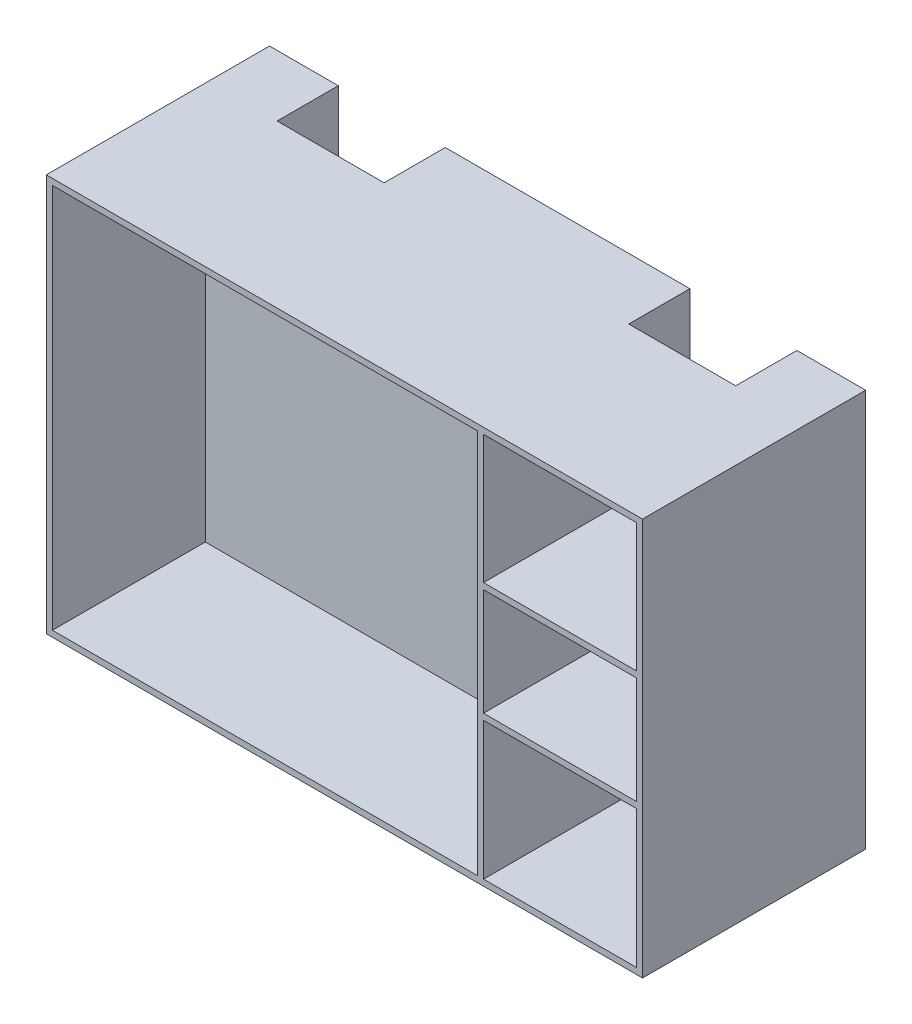
ISO-10303-21;
HEADER;
FILE_DESCRIPTION(('STEP AP214'),'2;1');
FILE_NAME('part.step','',(''),(''),'','','');
FILE_SCHEMA(('AUTOMOTIVE_DESIGN { 1 0 10303 214 1 1 1 1 }'));
ENDSEC;
DATA;
#1=APPLICATION_CONTEXT('core data for automotive mechanical design processes');
#2=APPLICATION_PROTOCOL_DEFINITION('international standard','automotive_design',2000,#1);
#3=PRODUCT_CONTEXT('',#1,'mechanical');
#4=PRODUCT('Part','Part','',(#3));
#5=PRODUCT_RELATED_PRODUCT_CATEGORY('part','',(#4));
#6=PRODUCT_DEFINITION_FORMATION('','',#4);
#7=PRODUCT_DEFINITION_CONTEXT('part definition',#1,'design');
#8=PRODUCT_DEFINITION('design','',#6,#7);
#9=PRODUCT_DEFINITION_SHAPE('','',#8);
#10=(LENGTH_UNIT() NAMED_UNIT(*) SI_UNIT(.MILLI.,.METRE.));
#11=(NAMED_UNIT(*) PLANE_ANGLE_UNIT() SI_UNIT($,.RADIAN.));
#12=(NAMED_UNIT(*) SI_UNIT($,.STERADIAN.) SOLID_ANGLE_UNIT());
#13=UNCERTAINTY_MEASURE_WITH_UNIT(LENGTH_MEASURE(1.E-05),#10,'distance_accuracy_value','');
#14=(GEOMETRIC_REPRESENTATION_CONTEXT(3) GLOBAL_UNCERTAINTY_ASSIGNED_CONTEXT((#13)) GLOBAL_UNIT_ASSIGNED_CONTEXT((#10,
#11,#12)) REPRESENTATION_CONTEXT('',''));
#15=CARTESIAN_POINT('',(0.,0.,0.));
#16=DIRECTION('',(0.,0.,1.));
#17=DIRECTION('',(1.,0.,0.));
#18=AXIS2_PLACEMENT_3D('',#15,#16,#17);
#19=CARTESIAN_POINT('',(0.,0.,-23.));
#20=DIRECTION('',(0.,0.,-1.));
#21=DIRECTION('',(-1.,0.,0.));
#22=AXIS2_PLACEMENT_3D('',#19,#20,#21);
#23=PLANE('',#22);
#24=DIRECTION('',(0.,-1.,0.));
#25=VECTOR('',#24,1.);
#26=CARTESIAN_POINT('',(103.307004172774,61.4710040641087,-23.));
#27=LINE('',#26,#25);
#28=CARTESIAN_POINT('',(103.307004172774,61.4710040641087,-23.));
#29=VERTEX_POINT('',#28);
#30=CARTESIAN_POINT('',(103.307004172774,-68.5289959358913,-23.));
#31=VERTEX_POINT('',#30);
#32=EDGE_CURVE('E231',#29,#31,#27,.T.);
#33=ORIENTED_EDGE('',*,*,#32,.F.);
#34=DIRECTION('',(1.,0.,0.));
#35=VECTOR('',#34,1.);
#36=CARTESIAN_POINT('',(125.807004172774,61.4710040641087,-23.));
#37=LINE('',#36,#35);
#38=CARTESIAN_POINT('',(125.807004172774,61.4710040641087,-23.));
#39=VERTEX_POINT('',#38);
#40=EDGE_CURVE('E292',#29,#39,#37,.T.);
#41=ORIENTED_EDGE('',*,*,#40,.T.);
#42=DIRECTION('',(0.,-1.,0.));
#43=VECTOR('',#42,1.);
#44=CARTESIAN_POINT('',(125.807004172774,61.4710040641087,-23.));
#45=LINE('',#44,#43);
#46=CARTESIAN_POINT('',(125.807004172774,-68.5289959358913,-23.));
#47=VERTEX_POINT('',#46);
#48=EDGE_CURVE('E258',#39,#47,#45,.T.);
#49=ORIENTED_EDGE('',*,*,#48,.T.);
#50=DIRECTION('',(-1.,0.,0.));
#51=VECTOR('',#50,1.);
#52=CARTESIAN_POINT('',(125.807004172774,-68.5289959358913,-23.));
#53=LINE('',#52,#51);
#54=EDGE_CURVE('E282',#47,#31,#53,.T.);
#55=ORIENTED_EDGE('',*,*,#54,.T.);
#56=EDGE_LOOP('',(#33,#41,#49,#55));
#57=FACE_BOUND('',#56,.T.);
#58=ADVANCED_FACE('F39',(#57),#23,.T.);
#59=DIRECTION('',(0.,1.,0.));
#60=VECTOR('',#59,1.);
#61=CARTESIAN_POINT('',(68.3070041727736,61.4710040641087,-23.));
#62=LINE('',#61,#60);
#63=CARTESIAN_POINT('',(68.3070041727736,-68.5289959358913,-23.));
#64=VERTEX_POINT('',#63);
#65=CARTESIAN_POINT('',(68.3070041727736,61.4710040641087,-23.));
#66=VERTEX_POINT('',#65);
#67=EDGE_CURVE('E244',#64,#66,#62,.T.);
#68=ORIENTED_EDGE('',*,*,#67,.F.);
#69=CARTESIAN_POINT('',(-11.6929958272264,-68.5289959358913,-23.));
#70=VERTEX_POINT('',#69);
#71=EDGE_CURVE('E288',#64,#70,#53,.T.);
#72=ORIENTED_EDGE('',*,*,#71,.T.);
#73=DIRECTION('',(0.,-1.,0.));
#74=VECTOR('',#73,1.);
#75=CARTESIAN_POINT('',(-11.6929958272264,61.4710040641087,-23.));
#76=LINE('',#75,#74);
#77=CARTESIAN_POINT('',(-11.6929958272264,61.4710040641087,-23.));
#78=VERTEX_POINT('',#77);
#79=EDGE_CURVE('E252',#78,#70,#76,.T.);
#80=ORIENTED_EDGE('',*,*,#79,.F.);
#81=EDGE_CURVE('E298',#78,#66,#37,.T.);
#82=ORIENTED_EDGE('',*,*,#81,.T.);
#83=EDGE_LOOP('',(#68,#72,#80,#82));
#84=FACE_BOUND('',#83,.T.);
#85=ADVANCED_FACE('F470',(#84),#23,.T.);
#86=CARTESIAN_POINT('',(125.807004172774,-68.5289959358913,50.));
#87=DIRECTION('',(0.,-1.,0.));
#88=DIRECTION('',(0.,0.,-1.));
#89=AXIS2_PLACEMENT_3D('',#86,#87,#88);
#90=PLANE('',#89);
#91=DIRECTION('',(-1.,0.,0.));
#92=VECTOR('',#91,1.);
#93=CARTESIAN_POINT('',(103.307004172774,-68.5289959358913,-3.));
#94=LINE('',#93,#92);
#95=CARTESIAN_POINT('',(103.307004172774,-68.5289959358913,-3.));
#96=VERTEX_POINT('',#95);
#97=CARTESIAN_POINT('',(68.3070041727736,-68.5289959358913,-3.));
#98=VERTEX_POINT('',#97);
#99=EDGE_CURVE('E238',#96,#98,#94,.T.);
#100=ORIENTED_EDGE('',*,*,#99,.F.);
#101=DIRECTION('',(0.,0.,-1.));
#102=VECTOR('',#101,1.);
#103=CARTESIAN_POINT('',(103.307004172774,-68.5289959358913,-3.));
#104=LINE('',#103,#102);
#105=EDGE_CURVE('E228',#96,#31,#104,.T.);
#106=ORIENTED_EDGE('',*,*,#105,.T.);
#107=ORIENTED_EDGE('',*,*,#54,.F.);
#108=DIRECTION('',(0.,0.,-1.));
#109=VECTOR('',#108,1.);
#110=CARTESIAN_POINT('',(125.807004172774,-68.5289959358913,50.));
#111=LINE('',#110,#109);
#112=CARTESIAN_POINT('',(125.807004172774,-68.5289959358913,50.));
#113=VERTEX_POINT('',#112);
#114=EDGE_CURVE('E11',#113,#47,#111,.T.);
#115=ORIENTED_EDGE('',*,*,#114,.F.);
#116=DIRECTION('',(-1.,0.,0.));
#117=VECTOR('',#116,1.);
#118=CARTESIAN_POINT('',(125.807004172774,-68.5289959358913,50.));
#119=LINE('',#118,#117);
#120=CARTESIAN_POINT('',(-69.1929958272264,-68.5289959358913,50.));
#121=VERTEX_POINT('',#120);
#122=EDGE_CURVE('E416',#113,#121,#119,.T.);
#123=ORIENTED_EDGE('',*,*,#122,.T.);
#124=DIRECTION('',(0.,0.,-1.));
#125=VECTOR('',#124,1.);
#126=CARTESIAN_POINT('',(-69.1929958272264,-68.5289959358913,50.));
#127=LINE('',#126,#125);
#128=CARTESIAN_POINT('',(-69.1929958272264,-68.5289959358913,-23.));
#129=VERTEX_POINT('',#128);
#130=EDGE_CURVE('E43',#121,#129,#127,.T.);
#131=ORIENTED_EDGE('',*,*,#130,.T.);
#132=CARTESIAN_POINT('',(-46.6929958272264,-68.5289959358913,-23.));
#133=VERTEX_POINT('',#132);
#134=EDGE_CURVE('E284',#133,#129,#53,.T.);
#135=ORIENTED_EDGE('',*,*,#134,.F.);
#136=DIRECTION('',(0.,0.,-1.));
#137=VECTOR('',#136,1.);
#138=CARTESIAN_POINT('',(-46.6929958272264,-68.5289959358913,-3.));
#139=LINE('',#138,#137);
#140=CARTESIAN_POINT('',(-46.6929958272264,-68.5289959358913,-3.));
#141=VERTEX_POINT('',#140);
#142=EDGE_CURVE('E264',#141,#133,#139,.T.);
#143=ORIENTED_EDGE('',*,*,#142,.F.);
#144=DIRECTION('',(-1.,0.,0.));
#145=VECTOR('',#144,1.);
#146=CARTESIAN_POINT('',(-11.6929958272264,-68.5289959358913,-3.));
#147=LINE('',#146,#145);
#148=CARTESIAN_POINT('',(-11.6929958272264,-68.5289959358913,-3.));
#149=VERTEX_POINT('',#148);
#150=EDGE_CURVE('E279',#149,#141,#147,.T.);
#151=ORIENTED_EDGE('',*,*,#150,.F.);
#152=DIRECTION('',(0.,0.,-1.));
#153=VECTOR('',#152,1.);
#154=CARTESIAN_POINT('',(-11.6929958272264,-68.5289959358913,-3.));
#155=LINE('',#154,#153);
#156=EDGE_CURVE('E261',#149,#70,#155,.T.);
#157=ORIENTED_EDGE('',*,*,#156,.T.);
#158=ORIENTED_EDGE('',*,*,#71,.F.);
#159=DIRECTION('',(0.,0.,-1.));
#160=VECTOR('',#159,1.);
#161=CARTESIAN_POINT('',(68.3070041727736,-68.5289959358913,-3.));
#162=LINE('',#161,#160);
#163=EDGE_CURVE('E237',#98,#64,#162,.T.);
#164=ORIENTED_EDGE('',*,*,#163,.F.);
#165=EDGE_LOOP('',(#100,#106,#107,#115,#123,#131,#135,#143,#151,#157,#158,#164));
#166=FACE_BOUND('',#165,.T.);
#167=ADVANCED_FACE('F41',(#166),#90,.T.);
#168=CARTESIAN_POINT('',(-69.1929958272264,61.4710040641087,50.));
#169=DIRECTION('',(0.,1.,0.));
#170=DIRECTION('',(0.,0.,1.));
#171=AXIS2_PLACEMENT_3D('',#168,#169,#170);
#172=PLANE('',#171);
#173=DIRECTION('',(1.,0.,0.));
#174=VECTOR('',#173,1.);
#175=CARTESIAN_POINT('',(103.307004172774,61.4710040641087,-3.));
#176=LINE('',#175,#174);
#177=CARTESIAN_POINT('',(68.3070041727736,61.4710040641087,-3.));
#178=VERTEX_POINT('',#177);
#179=CARTESIAN_POINT('',(103.307004172774,61.4710040641087,-3.));
#180=VERTEX_POINT('',#179);
#181=EDGE_CURVE('E240',#178,#180,#176,.T.);
#182=ORIENTED_EDGE('',*,*,#181,.F.);
#183=DIRECTION('',(0.,0.,-1.));
#184=VECTOR('',#183,1.);
#185=CARTESIAN_POINT('',(68.3070041727736,61.4710040641087,-3.));
#186=LINE('',#185,#184);
#187=EDGE_CURVE('E260',#178,#66,#186,.T.);
#188=ORIENTED_EDGE('',*,*,#187,.T.);
#189=ORIENTED_EDGE('',*,*,#81,.F.);
#190=DIRECTION('',(0.,0.,-1.));
#191=VECTOR('',#190,1.);
#192=CARTESIAN_POINT('',(-11.6929958272264,61.4710040641087,-3.));
#193=LINE('',#192,#191);
#194=CARTESIAN_POINT('',(-11.6929958272264,61.4710040641087,-3.));
#195=VERTEX_POINT('',#194);
#196=EDGE_CURVE('E269',#195,#78,#193,.T.);
#197=ORIENTED_EDGE('',*,*,#196,.F.);
#198=DIRECTION('',(1.,0.,0.));
#199=VECTOR('',#198,1.);
#200=CARTESIAN_POINT('',(-11.6929958272264,61.4710040641087,-3.));
#201=LINE('',#200,#199);
#202=CARTESIAN_POINT('',(-46.6929958272264,61.4710040641087,-3.));
#203=VERTEX_POINT('',#202);
#204=EDGE_CURVE('E262',#203,#195,#201,.T.);
#205=ORIENTED_EDGE('',*,*,#204,.F.);
#206=DIRECTION('',(0.,0.,-1.));
#207=VECTOR('',#206,1.);
#208=CARTESIAN_POINT('',(-46.6929958272264,61.4710040641087,-3.));
#209=LINE('',#208,#207);
#210=CARTESIAN_POINT('',(-46.6929958272264,61.4710040641087,-23.));
#211=VERTEX_POINT('',#210);
#212=EDGE_CURVE('E270',#203,#211,#209,.T.);
#213=ORIENTED_EDGE('',*,*,#212,.T.);
#214=CARTESIAN_POINT('',(-69.1929958272264,61.4710040641087,-23.));
#215=VERTEX_POINT('',#214);
#216=EDGE_CURVE('E295',#215,#211,#37,.T.);
#217=ORIENTED_EDGE('',*,*,#216,.F.);
#218=DIRECTION('',(0.,0.,-1.));
#219=VECTOR('',#218,1.);
#220=CARTESIAN_POINT('',(-69.1929958272264,61.4710040641087,50.));
#221=LINE('',#220,#219);
#222=CARTESIAN_POINT('',(-69.1929958272264,61.4710040641087,50.));
#223=VERTEX_POINT('',#222);
#224=EDGE_CURVE('E440',#223,#215,#221,.T.);
#225=ORIENTED_EDGE('',*,*,#224,.F.);
#226=DIRECTION('',(1.,0.,0.));
#227=VECTOR('',#226,1.);
#228=CARTESIAN_POINT('',(-69.1929958272264,61.4710040641087,50.));
#229=LINE('',#228,#227);
#230=CARTESIAN_POINT('',(125.807004172774,61.4710040641087,50.));
#231=VERTEX_POINT('',#230);
#232=EDGE_CURVE('E429',#223,#231,#229,.T.);
#233=ORIENTED_EDGE('',*,*,#232,.T.);
#234=DIRECTION('',(0.,0.,-1.));
#235=VECTOR('',#234,1.);
#236=CARTESIAN_POINT('',(125.807004172774,61.4710040641087,50.));
#237=LINE('',#236,#235);
#238=EDGE_CURVE('E48',#231,#39,#237,.T.);
#239=ORIENTED_EDGE('',*,*,#238,.T.);
#240=ORIENTED_EDGE('',*,*,#40,.F.);
#241=DIRECTION('',(0.,0.,-1.));
#242=VECTOR('',#241,1.);
#243=CARTESIAN_POINT('',(103.307004172774,61.4710040641087,-3.));
#244=LINE('',#243,#242);
#245=EDGE_CURVE('E255',#180,#29,#244,.T.);
#246=ORIENTED_EDGE('',*,*,#245,.F.);
#247=EDGE_LOOP('',(#182,#188,#189,#197,#205,#213,#217,#225,#233,#239,#240,#246));
#248=FACE_BOUND('',#247,.T.);
#249=ADVANCED_FACE('F451',(#248),#172,.T.);
#250=CARTESIAN_POINT('',(125.807004172774,61.4710040641087,50.));
#251=DIRECTION('',(1.,0.,0.));
#252=DIRECTION('',(0.,0.,-1.));
#253=AXIS2_PLACEMENT_3D('',#250,#251,#252);
#254=PLANE('',#253);
#255=ORIENTED_EDGE('',*,*,#114,.T.);
#256=ORIENTED_EDGE('',*,*,#48,.F.);
#257=ORIENTED_EDGE('',*,*,#238,.F.);
#258=DIRECTION('',(0.,-1.,0.));
#259=VECTOR('',#258,1.);
#260=CARTESIAN_POINT('',(125.807004172774,61.4710040641087,50.));
#261=LINE('',#260,#259);
#262=EDGE_CURVE('E433',#231,#113,#261,.T.);
#263=ORIENTED_EDGE('',*,*,#262,.T.);
#264=EDGE_LOOP('',(#255,#256,#257,#263));
#265=FACE_BOUND('',#264,.T.);
#266=ADVANCED_FACE('F471',(#265),#254,.T.);
#267=CARTESIAN_POINT('',(-69.1929958272264,-68.5289959358913,50.));
#268=DIRECTION('',(-1.,0.,0.));
#269=DIRECTION('',(0.,0.,1.));
#270=AXIS2_PLACEMENT_3D('',#267,#268,#269);
#271=PLANE('',#270);
#272=ORIENTED_EDGE('',*,*,#224,.T.);
#273=DIRECTION('',(0.,1.,0.));
#274=VECTOR('',#273,1.);
#275=CARTESIAN_POINT('',(-69.1929958272264,61.4710040641087,-23.));
#276=LINE('',#275,#274);
#277=EDGE_CURVE('E290',#129,#215,#276,.T.);
#278=ORIENTED_EDGE('',*,*,#277,.F.);
#279=ORIENTED_EDGE('',*,*,#130,.F.);
#280=DIRECTION('',(0.,1.,0.));
#281=VECTOR('',#280,1.);
#282=CARTESIAN_POINT('',(-69.1929958272264,-68.5289959358913,50.));
#283=LINE('',#282,#281);
#284=EDGE_CURVE('E430',#121,#223,#283,.T.);
#285=ORIENTED_EDGE('',*,*,#284,.T.);
#286=EDGE_LOOP('',(#272,#278,#279,#285));
#287=FACE_BOUND('',#286,.T.);
#288=ADVANCED_FACE('F443',(#287),#271,.T.);
#289=CARTESIAN_POINT('',(0.,0.,50.));
#290=DIRECTION('',(0.,0.,-1.));
#291=DIRECTION('',(-1.,0.,0.));
#292=AXIS2_PLACEMENT_3D('',#289,#290,#291);
#293=PLANE('',#292);
#294=DIRECTION('',(0.,-1.,0.));
#295=VECTOR('',#294,1.);
#296=CARTESIAN_POINT('',(73.8070041727736,15.4710040641087,50.));
#297=LINE('',#296,#295);
#298=CARTESIAN_POINT('',(73.8070041727736,15.4710040641087,50.));
#299=VERTEX_POINT('',#298);
#300=CARTESIAN_POINT('',(73.8070041727736,-19.5289959358913,50.));
#301=VERTEX_POINT('',#300);
#302=EDGE_CURVE('E315',#299,#301,#297,.T.);
#303=ORIENTED_EDGE('',*,*,#302,.F.);
#304=DIRECTION('',(-1.,0.,0.));
#305=VECTOR('',#304,1.);
#306=CARTESIAN_POINT('',(123.807004172774,15.4710040641087,50.));
#307=LINE('',#306,#305);
#308=CARTESIAN_POINT('',(123.807004172774,15.4710040641087,50.));
#309=VERTEX_POINT('',#308);
#310=EDGE_CURVE('E293',#309,#299,#307,.T.);
#311=ORIENTED_EDGE('',*,*,#310,.F.);
#312=DIRECTION('',(0.,1.,0.));
#313=VECTOR('',#312,1.);
#314=CARTESIAN_POINT('',(123.807004172774,-19.5289959358913,50.));
#315=LINE('',#314,#313);
#316=CARTESIAN_POINT('',(123.807004172774,-19.5289959358913,50.));
#317=VERTEX_POINT('',#316);
#318=EDGE_CURVE('E301',#317,#309,#315,.T.);
#319=ORIENTED_EDGE('',*,*,#318,.F.);
#320=DIRECTION('',(1.,0.,0.));
#321=VECTOR('',#320,1.);
#322=CARTESIAN_POINT('',(73.8070041727736,-19.5289959358913,50.));
#323=LINE('',#322,#321);
#324=EDGE_CURVE('E312',#301,#317,#323,.T.);
#325=ORIENTED_EDGE('',*,*,#324,.F.);
#326=EDGE_LOOP('',(#303,#311,#319,#325));
#327=FACE_BOUND('',#326,.T.);
#328=DIRECTION('',(0.,-1.,0.));
#329=VECTOR('',#328,1.);
#330=CARTESIAN_POINT('',(73.8070041727736,-21.5289959358913,50.));
#331=LINE('',#330,#329);
#332=CARTESIAN_POINT('',(73.8070041727736,-21.5289959358913,50.));
#333=VERTEX_POINT('',#332);
#334=CARTESIAN_POINT('',(73.8070041727736,-66.5289959358913,50.));
#335=VERTEX_POINT('',#334);
#336=EDGE_CURVE('E342',#333,#335,#331,.T.);
#337=ORIENTED_EDGE('',*,*,#336,.F.);
#338=DIRECTION('',(-1.,0.,0.));
#339=VECTOR('',#338,1.);
#340=CARTESIAN_POINT('',(123.807004172774,-21.5289959358913,50.));
#341=LINE('',#340,#339);
#342=CARTESIAN_POINT('',(123.807004172774,-21.5289959358913,50.));
#343=VERTEX_POINT('',#342);
#344=EDGE_CURVE('E325',#343,#333,#341,.T.);
#345=ORIENTED_EDGE('',*,*,#344,.F.);
#346=DIRECTION('',(0.,1.,0.));
#347=VECTOR('',#346,1.);
#348=CARTESIAN_POINT('',(123.807004172774,-66.5289959358913,50.));
#349=LINE('',#348,#347);
#350=CARTESIAN_POINT('',(123.807004172774,-66.5289959358913,50.));
#351=VERTEX_POINT('',#350);
#352=EDGE_CURVE('E334',#351,#343,#349,.T.);
#353=ORIENTED_EDGE('',*,*,#352,.F.);
#354=DIRECTION('',(1.,0.,0.));
#355=VECTOR('',#354,1.);
#356=CARTESIAN_POINT('',(73.8070041727736,-66.5289959358913,50.));
#357=LINE('',#356,#355);
#358=EDGE_CURVE('E350',#335,#351,#357,.T.);
#359=ORIENTED_EDGE('',*,*,#358,.F.);
#360=EDGE_LOOP('',(#337,#345,#353,#359));
#361=FACE_BOUND('',#360,.T.);
#362=DIRECTION('',(1.,0.,0.));
#363=VECTOR('',#362,1.);
#364=CARTESIAN_POINT('',(73.8070041727736,17.4710040641087,50.));
#365=LINE('',#364,#363);
#366=CARTESIAN_POINT('',(73.8070041727736,17.4710040641087,50.));
#367=VERTEX_POINT('',#366);
#368=CARTESIAN_POINT('',(123.807004172774,17.4710040641087,50.));
#369=VERTEX_POINT('',#368);
#370=EDGE_CURVE('E376',#367,#369,#365,.T.);
#371=ORIENTED_EDGE('',*,*,#370,.F.);
#372=DIRECTION('',(0.,-1.,0.));
#373=VECTOR('',#372,1.);
#374=CARTESIAN_POINT('',(73.8070041727736,59.4710040641087,50.));
#375=LINE('',#374,#373);
#376=CARTESIAN_POINT('',(73.8070041727736,59.4710040641087,50.));
#377=VERTEX_POINT('',#376);
#378=EDGE_CURVE('E354',#377,#367,#375,.T.);
#379=ORIENTED_EDGE('',*,*,#378,.F.);
#380=DIRECTION('',(-1.,0.,0.));
#381=VECTOR('',#380,1.);
#382=CARTESIAN_POINT('',(123.807004172774,59.4710040641087,50.));
#383=LINE('',#382,#381);
#384=CARTESIAN_POINT('',(123.807004172774,59.4710040641087,50.));
#385=VERTEX_POINT('',#384);
#386=EDGE_CURVE('E364',#385,#377,#383,.T.);
#387=ORIENTED_EDGE('',*,*,#386,.F.);
#388=DIRECTION('',(0.,1.,0.));
#389=VECTOR('',#388,1.);
#390=CARTESIAN_POINT('',(123.807004172774,17.4710040641087,50.));
#391=LINE('',#390,#389);
#392=EDGE_CURVE('E377',#369,#385,#391,.T.);
#393=ORIENTED_EDGE('',*,*,#392,.F.);
#394=EDGE_LOOP('',(#371,#379,#387,#393));
#395=FACE_BOUND('',#394,.T.);
#396=DIRECTION('',(0.,1.,0.));
#397=VECTOR('',#396,1.);
#398=CARTESIAN_POINT('',(71.8070041727736,-66.5289959358913,50.));
#399=LINE('',#398,#397);
#400=CARTESIAN_POINT('',(71.8070041727736,-66.5289959358913,50.));
#401=VERTEX_POINT('',#400);
#402=CARTESIAN_POINT('',(71.8070041727736,59.4710040641087,50.));
#403=VERTEX_POINT('',#402);
#404=EDGE_CURVE('E406',#401,#403,#399,.T.);
#405=ORIENTED_EDGE('',*,*,#404,.F.);
#406=DIRECTION('',(1.,0.,0.));
#407=VECTOR('',#406,1.);
#408=CARTESIAN_POINT('',(-67.1929958272264,-66.5289959358913,50.));
#409=LINE('',#408,#407);
#410=CARTESIAN_POINT('',(-67.1929958272264,-66.5289959358913,50.));
#411=VERTEX_POINT('',#410);
#412=EDGE_CURVE('E387',#411,#401,#409,.T.);
#413=ORIENTED_EDGE('',*,*,#412,.F.);
#414=DIRECTION('',(0.,-1.,0.));
#415=VECTOR('',#414,1.);
#416=CARTESIAN_POINT('',(-67.1929958272264,59.4710040641087,50.));
#417=LINE('',#416,#415);
#418=CARTESIAN_POINT('',(-67.1929958272264,59.4710040641087,50.));
#419=VERTEX_POINT('',#418);
#420=EDGE_CURVE('E400',#419,#411,#417,.T.);
#421=ORIENTED_EDGE('',*,*,#420,.F.);
#422=DIRECTION('',(-1.,0.,0.));
#423=VECTOR('',#422,1.);
#424=CARTESIAN_POINT('',(71.8070041727736,59.4710040641087,50.));
#425=LINE('',#424,#423);
#426=EDGE_CURVE('E411',#403,#419,#425,.T.);
#427=ORIENTED_EDGE('',*,*,#426,.F.);
#428=EDGE_LOOP('',(#405,#413,#421,#427));
#429=FACE_BOUND('',#428,.T.);
#430=ORIENTED_EDGE('',*,*,#122,.F.);
#431=ORIENTED_EDGE('',*,*,#262,.F.);
#432=ORIENTED_EDGE('',*,*,#232,.F.);
#433=ORIENTED_EDGE('',*,*,#284,.F.);
#434=EDGE_LOOP('',(#430,#431,#432,#433));
#435=FACE_BOUND('',#434,.T.);
#436=ADVANCED_FACE('F474',(#327,#361,#395,#429,#435),#293,.F.);
#437=CARTESIAN_POINT('',(-67.1929958272264,-66.5289959358913,0.));
#438=DIRECTION('',(0.,-1.,0.));
#439=DIRECTION('',(1.,0.,0.));
#440=AXIS2_PLACEMENT_3D('',#437,#438,#439);
#441=PLANE('',#440);
#442=ORIENTED_EDGE('',*,*,#412,.T.);
#443=DIRECTION('',(0.,0.,1.));
#444=VECTOR('',#443,1.);
#445=CARTESIAN_POINT('',(71.8070041727736,-66.5289959358913,0.));
#446=LINE('',#445,#444);
#447=CARTESIAN_POINT('',(71.8070041727736,-66.5289959358913,0.));
#448=VERTEX_POINT('',#447);
#449=EDGE_CURVE('E408',#448,#401,#446,.T.);
#450=ORIENTED_EDGE('',*,*,#449,.F.);
#451=DIRECTION('',(1.,0.,0.));
#452=VECTOR('',#451,1.);
#453=CARTESIAN_POINT('',(-67.1929958272264,-66.5289959358913,0.));
#454=LINE('',#453,#452);
#455=CARTESIAN_POINT('',(-67.1929958272264,-66.5289959358913,0.));
#456=VERTEX_POINT('',#455);
#457=EDGE_CURVE('E391',#456,#448,#454,.T.);
#458=ORIENTED_EDGE('',*,*,#457,.F.);
#459=DIRECTION('',(0.,0.,1.));
#460=VECTOR('',#459,1.);
#461=CARTESIAN_POINT('',(-67.1929958272264,-66.5289959358913,0.));
#462=LINE('',#461,#460);
#463=EDGE_CURVE('E418',#456,#411,#462,.T.);
#464=ORIENTED_EDGE('',*,*,#463,.T.);
#465=EDGE_LOOP('',(#442,#450,#458,#464));
#466=FACE_BOUND('',#465,.T.);
#467=ADVANCED_FACE('F480',(#466),#441,.F.);
#468=CARTESIAN_POINT('',(-67.1929958272264,59.4710040641087,0.));
#469=DIRECTION('',(-1.,0.,0.));
#470=DIRECTION('',(0.,-1.,0.));
#471=AXIS2_PLACEMENT_3D('',#468,#469,#470);
#472=PLANE('',#471);
#473=ORIENTED_EDGE('',*,*,#420,.T.);
#474=ORIENTED_EDGE('',*,*,#463,.F.);
#475=DIRECTION('',(0.,-1.,0.));
#476=VECTOR('',#475,1.);
#477=CARTESIAN_POINT('',(-67.1929958272264,59.4710040641087,0.));
#478=LINE('',#477,#476);
#479=CARTESIAN_POINT('',(-67.1929958272264,59.4710040641087,0.));
#480=VERTEX_POINT('',#479);
#481=EDGE_CURVE('E401',#480,#456,#478,.T.);
#482=ORIENTED_EDGE('',*,*,#481,.F.);
#483=DIRECTION('',(0.,0.,1.));
#484=VECTOR('',#483,1.);
#485=CARTESIAN_POINT('',(-67.1929958272264,59.4710040641087,0.));
#486=LINE('',#485,#484);
#487=EDGE_CURVE('E420',#480,#419,#486,.T.);
#488=ORIENTED_EDGE('',*,*,#487,.T.);
#489=EDGE_LOOP('',(#473,#474,#482,#488));
#490=FACE_BOUND('',#489,.T.);
#491=ADVANCED_FACE('F484',(#490),#472,.F.);
#492=CARTESIAN_POINT('',(71.8070041727736,59.4710040641087,0.));
#493=DIRECTION('',(0.,1.,0.));
#494=DIRECTION('',(0.,0.,1.));
#495=AXIS2_PLACEMENT_3D('',#492,#493,#494);
#496=PLANE('',#495);
#497=ORIENTED_EDGE('',*,*,#426,.T.);
#498=ORIENTED_EDGE('',*,*,#487,.F.);
#499=DIRECTION('',(-1.,0.,0.));
#500=VECTOR('',#499,1.);
#501=CARTESIAN_POINT('',(71.8070041727736,59.4710040641087,0.));
#502=LINE('',#501,#500);
#503=CARTESIAN_POINT('',(71.8070041727736,59.4710040641087,0.));
#504=VERTEX_POINT('',#503);
#505=EDGE_CURVE('E399',#504,#480,#502,.T.);
#506=ORIENTED_EDGE('',*,*,#505,.F.);
#507=DIRECTION('',(0.,0.,1.));
#508=VECTOR('',#507,1.);
#509=CARTESIAN_POINT('',(71.8070041727736,59.4710040641087,0.));
#510=LINE('',#509,#508);
#511=EDGE_CURVE('E423',#504,#403,#510,.T.);
#512=ORIENTED_EDGE('',*,*,#511,.T.);
#513=EDGE_LOOP('',(#497,#498,#506,#512));
#514=FACE_BOUND('',#513,.T.);
#515=ADVANCED_FACE('F571',(#514),#496,.F.);
#516=CARTESIAN_POINT('',(71.8070041727736,-66.5289959358913,0.));
#517=DIRECTION('',(1.,0.,0.));
#518=DIRECTION('',(0.,0.,-1.));
#519=AXIS2_PLACEMENT_3D('',#516,#517,#518);
#520=PLANE('',#519);
#521=ORIENTED_EDGE('',*,*,#404,.T.);
#522=ORIENTED_EDGE('',*,*,#511,.F.);
#523=DIRECTION('',(0.,1.,0.));
#524=VECTOR('',#523,1.);
#525=CARTESIAN_POINT('',(71.8070041727736,-66.5289959358913,0.));
#526=LINE('',#525,#524);
#527=EDGE_CURVE('E396',#448,#504,#526,.T.);
#528=ORIENTED_EDGE('',*,*,#527,.F.);
#529=ORIENTED_EDGE('',*,*,#449,.T.);
#530=EDGE_LOOP('',(#521,#522,#528,#529));
#531=FACE_BOUND('',#530,.T.);
#532=ADVANCED_FACE('F569',(#531),#520,.F.);
#533=CARTESIAN_POINT('',(0.,0.,0.));
#534=DIRECTION('',(0.,0.,1.));
#535=DIRECTION('',(1.,0.,0.));
#536=AXIS2_PLACEMENT_3D('',#533,#534,#535);
#537=PLANE('',#536);
#538=ORIENTED_EDGE('',*,*,#457,.T.);
#539=ORIENTED_EDGE('',*,*,#527,.T.);
#540=ORIENTED_EDGE('',*,*,#505,.T.);
#541=ORIENTED_EDGE('',*,*,#481,.T.);
#542=EDGE_LOOP('',(#538,#539,#540,#541));
#543=FACE_BOUND('',#542,.T.);
#544=ADVANCED_FACE('F564',(#543),#537,.T.);
#545=CARTESIAN_POINT('',(73.8070041727736,59.4710040641087,0.));
#546=DIRECTION('',(-1.,0.,0.));
#547=DIRECTION('',(0.,0.,1.));
#548=AXIS2_PLACEMENT_3D('',#545,#546,#547);
#549=PLANE('',#548);
#550=ORIENTED_EDGE('',*,*,#378,.T.);
#551=DIRECTION('',(0.,0.,1.));
#552=VECTOR('',#551,1.);
#553=CARTESIAN_POINT('',(73.8070041727736,17.4710040641087,0.));
#554=LINE('',#553,#552);
#555=CARTESIAN_POINT('',(73.8070041727736,17.4710040641087,0.));
#556=VERTEX_POINT('',#555);
#557=EDGE_CURVE('E372',#556,#367,#554,.T.);
#558=ORIENTED_EDGE('',*,*,#557,.F.);
#559=DIRECTION('',(0.,-1.,0.));
#560=VECTOR('',#559,1.);
#561=CARTESIAN_POINT('',(73.8070041727736,59.4710040641087,0.));
#562=LINE('',#561,#560);
#563=CARTESIAN_POINT('',(73.8070041727736,59.4710040641087,0.));
#564=VERTEX_POINT('',#563);
#565=EDGE_CURVE('E363',#564,#556,#562,.T.);
#566=ORIENTED_EDGE('',*,*,#565,.F.);
#567=DIRECTION('',(0.,0.,1.));
#568=VECTOR('',#567,1.);
#569=CARTESIAN_POINT('',(73.8070041727736,59.4710040641087,0.));
#570=LINE('',#569,#568);
#571=EDGE_CURVE('E383',#564,#377,#570,.T.);
#572=ORIENTED_EDGE('',*,*,#571,.T.);
#573=EDGE_LOOP('',(#550,#558,#566,#572));
#574=FACE_BOUND('',#573,.T.);
#575=ADVANCED_FACE('F553',(#574),#549,.F.);
#576=CARTESIAN_POINT('',(123.807004172774,59.4710040641087,0.));
#577=DIRECTION('',(0.,1.,0.));
#578=DIRECTION('',(0.,0.,1.));
#579=AXIS2_PLACEMENT_3D('',#576,#577,#578);
#580=PLANE('',#579);
#581=ORIENTED_EDGE('',*,*,#386,.T.);
#582=ORIENTED_EDGE('',*,*,#571,.F.);
#583=DIRECTION('',(-1.,0.,0.));
#584=VECTOR('',#583,1.);
#585=CARTESIAN_POINT('',(123.807004172774,59.4710040641087,0.));
#586=LINE('',#585,#584);
#587=CARTESIAN_POINT('',(123.807004172774,59.4710040641087,0.));
#588=VERTEX_POINT('',#587);
#589=EDGE_CURVE('E371',#588,#564,#586,.T.);
#590=ORIENTED_EDGE('',*,*,#589,.F.);
#591=DIRECTION('',(0.,0.,1.));
#592=VECTOR('',#591,1.);
#593=CARTESIAN_POINT('',(123.807004172774,59.4710040641087,0.));
#594=LINE('',#593,#592);
#595=EDGE_CURVE('E390',#588,#385,#594,.T.);
#596=ORIENTED_EDGE('',*,*,#595,.T.);
#597=EDGE_LOOP('',(#581,#582,#590,#596));
#598=FACE_BOUND('',#597,.T.);
#599=ADVANCED_FACE('F552',(#598),#580,.F.);
#600=CARTESIAN_POINT('',(123.807004172774,17.4710040641087,0.));
#601=DIRECTION('',(1.,0.,0.));
#602=DIRECTION('',(0.,0.,-1.));
#603=AXIS2_PLACEMENT_3D('',#600,#601,#602);
#604=PLANE('',#603);
#605=ORIENTED_EDGE('',*,*,#392,.T.);
#606=ORIENTED_EDGE('',*,*,#595,.F.);
#607=DIRECTION('',(0.,1.,0.));
#608=VECTOR('',#607,1.);
#609=CARTESIAN_POINT('',(123.807004172774,17.4710040641087,0.));
#610=LINE('',#609,#608);
#611=CARTESIAN_POINT('',(123.807004172774,17.4710040641087,0.));
#612=VERTEX_POINT('',#611);
#613=EDGE_CURVE('E366',#612,#588,#610,.T.);
#614=ORIENTED_EDGE('',*,*,#613,.F.);
#615=DIRECTION('',(0.,0.,1.));
#616=VECTOR('',#615,1.);
#617=CARTESIAN_POINT('',(123.807004172774,17.4710040641087,0.));
#618=LINE('',#617,#616);
#619=EDGE_CURVE('E386',#612,#369,#618,.T.);
#620=ORIENTED_EDGE('',*,*,#619,.T.);
#621=EDGE_LOOP('',(#605,#606,#614,#620));
#622=FACE_BOUND('',#621,.T.);
#623=ADVANCED_FACE('F551',(#622),#604,.F.);
#624=CARTESIAN_POINT('',(73.8070041727736,17.4710040641087,0.));
#625=DIRECTION('',(0.,-1.,0.));
#626=DIRECTION('',(0.,0.,-1.));
#627=AXIS2_PLACEMENT_3D('',#624,#625,#626);
#628=PLANE('',#627);
#629=ORIENTED_EDGE('',*,*,#370,.T.);
#630=ORIENTED_EDGE('',*,*,#619,.F.);
#631=DIRECTION('',(1.,0.,0.));
#632=VECTOR('',#631,1.);
#633=CARTESIAN_POINT('',(73.8070041727736,17.4710040641087,0.));
#634=LINE('',#633,#632);
#635=EDGE_CURVE('E365',#556,#612,#634,.T.);
#636=ORIENTED_EDGE('',*,*,#635,.F.);
#637=ORIENTED_EDGE('',*,*,#557,.T.);
#638=EDGE_LOOP('',(#629,#630,#636,#637));
#639=FACE_BOUND('',#638,.T.);
#640=ADVANCED_FACE('F548',(#639),#628,.F.);
#641=CARTESIAN_POINT('',(0.,0.,0.));
#642=DIRECTION('',(0.,0.,1.));
#643=DIRECTION('',(1.,0.,0.));
#644=AXIS2_PLACEMENT_3D('',#641,#642,#643);
#645=PLANE('',#644);
#646=ORIENTED_EDGE('',*,*,#565,.T.);
#647=ORIENTED_EDGE('',*,*,#635,.T.);
#648=ORIENTED_EDGE('',*,*,#613,.T.);
#649=ORIENTED_EDGE('',*,*,#589,.T.);
#650=EDGE_LOOP('',(#646,#647,#648,#649));
#651=FACE_BOUND('',#650,.T.);
#652=ADVANCED_FACE('F544',(#651),#645,.T.);
#653=CARTESIAN_POINT('',(123.807004172774,-21.5289959358913,0.));
#654=DIRECTION('',(0.,1.,0.));
#655=DIRECTION('',(-1.,0.,0.));
#656=AXIS2_PLACEMENT_3D('',#653,#654,#655);
#657=PLANE('',#656);
#658=ORIENTED_EDGE('',*,*,#344,.T.);
#659=DIRECTION('',(0.,0.,1.));
#660=VECTOR('',#659,1.);
#661=CARTESIAN_POINT('',(73.8070041727736,-21.5289959358913,0.));
#662=LINE('',#661,#660);
#663=CARTESIAN_POINT('',(73.8070041727736,-21.5289959358913,0.));
#664=VERTEX_POINT('',#663);
#665=EDGE_CURVE('E345',#664,#333,#662,.T.);
#666=ORIENTED_EDGE('',*,*,#665,.F.);
#667=DIRECTION('',(-1.,0.,0.));
#668=VECTOR('',#667,1.);
#669=CARTESIAN_POINT('',(123.807004172774,-21.5289959358913,0.));
#670=LINE('',#669,#668);
#671=CARTESIAN_POINT('',(123.807004172774,-21.5289959358913,0.));
#672=VERTEX_POINT('',#671);
#673=EDGE_CURVE('E328',#672,#664,#670,.T.);
#674=ORIENTED_EDGE('',*,*,#673,.F.);
#675=DIRECTION('',(0.,0.,1.));
#676=VECTOR('',#675,1.);
#677=CARTESIAN_POINT('',(123.807004172774,-21.5289959358913,0.));
#678=LINE('',#677,#676);
#679=EDGE_CURVE('E355',#672,#343,#678,.T.);
#680=ORIENTED_EDGE('',*,*,#679,.T.);
#681=EDGE_LOOP('',(#658,#666,#674,#680));
#682=FACE_BOUND('',#681,.T.);
#683=ADVANCED_FACE('F532',(#682),#657,.F.);
#684=CARTESIAN_POINT('',(123.807004172774,-66.5289959358913,0.));
#685=DIRECTION('',(1.,0.,0.));
#686=DIRECTION('',(0.,0.,-1.));
#687=AXIS2_PLACEMENT_3D('',#684,#685,#686);
#688=PLANE('',#687);
#689=ORIENTED_EDGE('',*,*,#352,.T.);
#690=ORIENTED_EDGE('',*,*,#679,.F.);
#691=DIRECTION('',(0.,1.,0.));
#692=VECTOR('',#691,1.);
#693=CARTESIAN_POINT('',(123.807004172774,-66.5289959358913,0.));
#694=LINE('',#693,#692);
#695=CARTESIAN_POINT('',(123.807004172774,-66.5289959358913,0.));
#696=VERTEX_POINT('',#695);
#697=EDGE_CURVE('E339',#696,#672,#694,.T.);
#698=ORIENTED_EDGE('',*,*,#697,.F.);
#699=DIRECTION('',(0.,0.,1.));
#700=VECTOR('',#699,1.);
#701=CARTESIAN_POINT('',(123.807004172774,-66.5289959358913,0.));
#702=LINE('',#701,#700);
#703=EDGE_CURVE('E352',#696,#351,#702,.T.);
#704=ORIENTED_EDGE('',*,*,#703,.T.);
#705=EDGE_LOOP('',(#689,#690,#698,#704));
#706=FACE_BOUND('',#705,.T.);
#707=ADVANCED_FACE('F533',(#706),#688,.F.);
#708=CARTESIAN_POINT('',(73.8070041727736,-66.5289959358913,0.));
#709=DIRECTION('',(0.,-1.,0.));
#710=DIRECTION('',(0.,0.,-1.));
#711=AXIS2_PLACEMENT_3D('',#708,#709,#710);
#712=PLANE('',#711);
#713=ORIENTED_EDGE('',*,*,#358,.T.);
#714=ORIENTED_EDGE('',*,*,#703,.F.);
#715=DIRECTION('',(1.,0.,0.));
#716=VECTOR('',#715,1.);
#717=CARTESIAN_POINT('',(73.8070041727736,-66.5289959358913,0.));
#718=LINE('',#717,#716);
#719=CARTESIAN_POINT('',(73.8070041727736,-66.5289959358913,0.));
#720=VERTEX_POINT('',#719);
#721=EDGE_CURVE('E338',#720,#696,#718,.T.);
#722=ORIENTED_EDGE('',*,*,#721,.F.);
#723=DIRECTION('',(0.,0.,1.));
#724=VECTOR('',#723,1.);
#725=CARTESIAN_POINT('',(73.8070041727736,-66.5289959358913,0.));
#726=LINE('',#725,#724);
#727=EDGE_CURVE('E360',#720,#335,#726,.T.);
#728=ORIENTED_EDGE('',*,*,#727,.T.);
#729=EDGE_LOOP('',(#713,#714,#722,#728));
#730=FACE_BOUND('',#729,.T.);
#731=ADVANCED_FACE('F534',(#730),#712,.F.);
#732=CARTESIAN_POINT('',(73.8070041727736,-21.5289959358913,0.));
#733=DIRECTION('',(-1.,0.,0.));
#734=DIRECTION('',(0.,0.,1.));
#735=AXIS2_PLACEMENT_3D('',#732,#733,#734);
#736=PLANE('',#735);
#737=ORIENTED_EDGE('',*,*,#336,.T.);
#738=ORIENTED_EDGE('',*,*,#727,.F.);
#739=DIRECTION('',(0.,-1.,0.));
#740=VECTOR('',#739,1.);
#741=CARTESIAN_POINT('',(73.8070041727736,-21.5289959358913,0.));
#742=LINE('',#741,#740);
#743=EDGE_CURVE('E335',#664,#720,#742,.T.);
#744=ORIENTED_EDGE('',*,*,#743,.F.);
#745=ORIENTED_EDGE('',*,*,#665,.T.);
#746=EDGE_LOOP('',(#737,#738,#744,#745));
#747=FACE_BOUND('',#746,.T.);
#748=ADVANCED_FACE('F530',(#747),#736,.F.);
#749=CARTESIAN_POINT('',(0.,0.,0.));
#750=DIRECTION('',(0.,0.,1.));
#751=DIRECTION('',(1.,0.,0.));
#752=AXIS2_PLACEMENT_3D('',#749,#750,#751);
#753=PLANE('',#752);
#754=ORIENTED_EDGE('',*,*,#673,.T.);
#755=ORIENTED_EDGE('',*,*,#743,.T.);
#756=ORIENTED_EDGE('',*,*,#721,.T.);
#757=ORIENTED_EDGE('',*,*,#697,.T.);
#758=EDGE_LOOP('',(#754,#755,#756,#757));
#759=FACE_BOUND('',#758,.T.);
#760=ADVANCED_FACE('F528',(#759),#753,.T.);
#761=CARTESIAN_POINT('',(123.807004172774,15.4710040641087,0.));
#762=DIRECTION('',(0.,1.,0.));
#763=DIRECTION('',(0.,0.,1.));
#764=AXIS2_PLACEMENT_3D('',#761,#762,#763);
#765=PLANE('',#764);
#766=ORIENTED_EDGE('',*,*,#310,.T.);
#767=DIRECTION('',(0.,0.,1.));
#768=VECTOR('',#767,1.);
#769=CARTESIAN_POINT('',(73.8070041727736,15.4710040641087,0.));
#770=LINE('',#769,#768);
#771=CARTESIAN_POINT('',(73.8070041727736,15.4710040641087,0.));
#772=VERTEX_POINT('',#771);
#773=EDGE_CURVE('E309',#772,#299,#770,.T.);
#774=ORIENTED_EDGE('',*,*,#773,.F.);
#775=DIRECTION('',(-1.,0.,0.));
#776=VECTOR('',#775,1.);
#777=CARTESIAN_POINT('',(123.807004172774,15.4710040641087,0.));
#778=LINE('',#777,#776);
#779=CARTESIAN_POINT('',(123.807004172774,15.4710040641087,0.));
#780=VERTEX_POINT('',#779);
#781=EDGE_CURVE('E300',#780,#772,#778,.T.);
#782=ORIENTED_EDGE('',*,*,#781,.F.);
#783=DIRECTION('',(0.,0.,1.));
#784=VECTOR('',#783,1.);
#785=CARTESIAN_POINT('',(123.807004172774,15.4710040641087,0.));
#786=LINE('',#785,#784);
#787=EDGE_CURVE('E319',#780,#309,#786,.T.);
#788=ORIENTED_EDGE('',*,*,#787,.T.);
#789=EDGE_LOOP('',(#766,#774,#782,#788));
#790=FACE_BOUND('',#789,.T.);
#791=ADVANCED_FACE('F517',(#790),#765,.F.);
#792=CARTESIAN_POINT('',(123.807004172774,-19.5289959358913,0.));
#793=DIRECTION('',(1.,0.,0.));
#794=DIRECTION('',(0.,0.,-1.));
#795=AXIS2_PLACEMENT_3D('',#792,#793,#794);
#796=PLANE('',#795);
#797=ORIENTED_EDGE('',*,*,#318,.T.);
#798=ORIENTED_EDGE('',*,*,#787,.F.);
#799=DIRECTION('',(0.,1.,0.));
#800=VECTOR('',#799,1.);
#801=CARTESIAN_POINT('',(123.807004172774,-19.5289959358913,0.));
#802=LINE('',#801,#800);
#803=CARTESIAN_POINT('',(123.807004172774,-19.5289959358913,0.));
#804=VERTEX_POINT('',#803);
#805=EDGE_CURVE('E307',#804,#780,#802,.T.);
#806=ORIENTED_EDGE('',*,*,#805,.F.);
#807=DIRECTION('',(0.,0.,1.));
#808=VECTOR('',#807,1.);
#809=CARTESIAN_POINT('',(123.807004172774,-19.5289959358913,0.));
#810=LINE('',#809,#808);
#811=EDGE_CURVE('E323',#804,#317,#810,.T.);
#812=ORIENTED_EDGE('',*,*,#811,.T.);
#813=EDGE_LOOP('',(#797,#798,#806,#812));
#814=FACE_BOUND('',#813,.T.);
#815=ADVANCED_FACE('F520',(#814),#796,.F.);
#816=CARTESIAN_POINT('',(73.8070041727736,-19.5289959358913,0.));
#817=DIRECTION('',(0.,-1.,0.));
#818=DIRECTION('',(1.,0.,0.));
#819=AXIS2_PLACEMENT_3D('',#816,#817,#818);
#820=PLANE('',#819);
#821=ORIENTED_EDGE('',*,*,#324,.T.);
#822=ORIENTED_EDGE('',*,*,#811,.F.);
#823=DIRECTION('',(1.,0.,0.));
#824=VECTOR('',#823,1.);
#825=CARTESIAN_POINT('',(73.8070041727736,-19.5289959358913,0.));
#826=LINE('',#825,#824);
#827=CARTESIAN_POINT('',(73.8070041727736,-19.5289959358913,0.));
#828=VERTEX_POINT('',#827);
#829=EDGE_CURVE('E302',#828,#804,#826,.T.);
#830=ORIENTED_EDGE('',*,*,#829,.F.);
#831=DIRECTION('',(0.,0.,1.));
#832=VECTOR('',#831,1.);
#833=CARTESIAN_POINT('',(73.8070041727736,-19.5289959358913,0.));
#834=LINE('',#833,#832);
#835=EDGE_CURVE('E324',#828,#301,#834,.T.);
#836=ORIENTED_EDGE('',*,*,#835,.T.);
#837=EDGE_LOOP('',(#821,#822,#830,#836));
#838=FACE_BOUND('',#837,.T.);
#839=ADVANCED_FACE('F511',(#838),#820,.F.);
#840=CARTESIAN_POINT('',(73.8070041727736,15.4710040641087,0.));
#841=DIRECTION('',(-1.,0.,0.));
#842=DIRECTION('',(0.,0.,1.));
#843=AXIS2_PLACEMENT_3D('',#840,#841,#842);
#844=PLANE('',#843);
#845=ORIENTED_EDGE('',*,*,#302,.T.);
#846=ORIENTED_EDGE('',*,*,#835,.F.);
#847=DIRECTION('',(0.,-1.,0.));
#848=VECTOR('',#847,1.);
#849=CARTESIAN_POINT('',(73.8070041727736,15.4710040641087,0.));
#850=LINE('',#849,#848);
#851=EDGE_CURVE('E297',#772,#828,#850,.T.);
#852=ORIENTED_EDGE('',*,*,#851,.F.);
#853=ORIENTED_EDGE('',*,*,#773,.T.);
#854=EDGE_LOOP('',(#845,#846,#852,#853));
#855=FACE_BOUND('',#854,.T.);
#856=ADVANCED_FACE('F510',(#855),#844,.F.);
#857=CARTESIAN_POINT('',(0.,0.,0.));
#858=DIRECTION('',(0.,0.,1.));
#859=DIRECTION('',(1.,0.,0.));
#860=AXIS2_PLACEMENT_3D('',#857,#858,#859);
#861=PLANE('',#860);
#862=ORIENTED_EDGE('',*,*,#781,.T.);
#863=ORIENTED_EDGE('',*,*,#851,.T.);
#864=ORIENTED_EDGE('',*,*,#829,.T.);
#865=ORIENTED_EDGE('',*,*,#805,.T.);
#866=EDGE_LOOP('',(#862,#863,#864,#865));
#867=FACE_BOUND('',#866,.T.);
#868=ADVANCED_FACE('F498',(#867),#861,.T.);
#869=DIRECTION('',(0.,1.,0.));
#870=VECTOR('',#869,1.);
#871=CARTESIAN_POINT('',(-46.6929958272264,61.4710040641087,-23.));
#872=LINE('',#871,#870);
#873=EDGE_CURVE('E275',#133,#211,#872,.T.);
#874=ORIENTED_EDGE('',*,*,#873,.F.);
#875=ORIENTED_EDGE('',*,*,#134,.T.);
#876=ORIENTED_EDGE('',*,*,#277,.T.);
#877=ORIENTED_EDGE('',*,*,#216,.T.);
#878=EDGE_LOOP('',(#874,#875,#876,#877));
#879=FACE_BOUND('',#878,.T.);
#880=ADVANCED_FACE('F449',(#879),#23,.T.);
#881=CARTESIAN_POINT('',(-11.6929958272264,61.4710040641087,-3.));
#882=DIRECTION('',(1.,0.,0.));
#883=DIRECTION('',(0.,1.,0.));
#884=AXIS2_PLACEMENT_3D('',#881,#882,#883);
#885=PLANE('',#884);
#886=ORIENTED_EDGE('',*,*,#79,.T.);
#887=ORIENTED_EDGE('',*,*,#156,.F.);
#888=DIRECTION('',(0.,-1.,0.));
#889=VECTOR('',#888,1.);
#890=CARTESIAN_POINT('',(-11.6929958272264,61.4710040641087,-3.));
#891=LINE('',#890,#889);
#892=EDGE_CURVE('E273',#195,#149,#891,.T.);
#893=ORIENTED_EDGE('',*,*,#892,.F.);
#894=ORIENTED_EDGE('',*,*,#196,.T.);
#895=EDGE_LOOP('',(#886,#887,#893,#894));
#896=FACE_BOUND('',#895,.T.);
#897=ADVANCED_FACE('F463',(#896),#885,.F.);
#898=CARTESIAN_POINT('',(-46.6929958272264,61.4710040641087,-3.));
#899=DIRECTION('',(-1.,0.,0.));
#900=DIRECTION('',(0.,-1.,0.));
#901=AXIS2_PLACEMENT_3D('',#898,#899,#900);
#902=PLANE('',#901);
#903=ORIENTED_EDGE('',*,*,#873,.T.);
#904=ORIENTED_EDGE('',*,*,#212,.F.);
#905=DIRECTION('',(0.,1.,0.));
#906=VECTOR('',#905,1.);
#907=CARTESIAN_POINT('',(-46.6929958272264,61.4710040641087,-3.));
#908=LINE('',#907,#906);
#909=EDGE_CURVE('E64',#141,#203,#908,.T.);
#910=ORIENTED_EDGE('',*,*,#909,.F.);
#911=ORIENTED_EDGE('',*,*,#142,.T.);
#912=EDGE_LOOP('',(#903,#904,#910,#911));
#913=FACE_BOUND('',#912,.T.);
#914=ADVANCED_FACE('F457',(#913),#902,.F.);
#915=CARTESIAN_POINT('',(0.,0.,-3.));
#916=DIRECTION('',(0.,0.,-1.));
#917=DIRECTION('',(-1.,0.,0.));
#918=AXIS2_PLACEMENT_3D('',#915,#916,#917);
#919=PLANE('',#918);
#920=ORIENTED_EDGE('',*,*,#892,.T.);
#921=ORIENTED_EDGE('',*,*,#150,.T.);
#922=ORIENTED_EDGE('',*,*,#909,.T.);
#923=ORIENTED_EDGE('',*,*,#204,.T.);
#924=EDGE_LOOP('',(#920,#921,#922,#923));
#925=FACE_BOUND('',#924,.T.);
#926=ADVANCED_FACE('F459',(#925),#919,.T.);
#927=CARTESIAN_POINT('',(103.307004172774,61.4710040641087,-3.));
#928=DIRECTION('',(1.,0.,0.));
#929=DIRECTION('',(0.,1.,0.));
#930=AXIS2_PLACEMENT_3D('',#927,#928,#929);
#931=PLANE('',#930);
#932=ORIENTED_EDGE('',*,*,#32,.T.);
#933=ORIENTED_EDGE('',*,*,#105,.F.);
#934=DIRECTION('',(0.,-1.,0.));
#935=VECTOR('',#934,1.);
#936=CARTESIAN_POINT('',(103.307004172774,61.4710040641087,-3.));
#937=LINE('',#936,#935);
#938=EDGE_CURVE('E229',#180,#96,#937,.T.);
#939=ORIENTED_EDGE('',*,*,#938,.F.);
#940=ORIENTED_EDGE('',*,*,#245,.T.);
#941=EDGE_LOOP('',(#932,#933,#939,#940));
#942=FACE_BOUND('',#941,.T.);
#943=ADVANCED_FACE('F226',(#942),#931,.F.);
#944=CARTESIAN_POINT('',(68.3070041727736,61.4710040641087,-3.));
#945=DIRECTION('',(-1.,0.,0.));
#946=DIRECTION('',(0.,-1.,0.));
#947=AXIS2_PLACEMENT_3D('',#944,#945,#946);
#948=PLANE('',#947);
#949=ORIENTED_EDGE('',*,*,#67,.T.);
#950=ORIENTED_EDGE('',*,*,#187,.F.);
#951=DIRECTION('',(0.,1.,0.));
#952=VECTOR('',#951,1.);
#953=CARTESIAN_POINT('',(68.3070041727736,61.4710040641087,-3.));
#954=LINE('',#953,#952);
#955=EDGE_CURVE('E57',#98,#178,#954,.T.);
#956=ORIENTED_EDGE('',*,*,#955,.F.);
#957=ORIENTED_EDGE('',*,*,#163,.T.);
#958=EDGE_LOOP('',(#949,#950,#956,#957));
#959=FACE_BOUND('',#958,.T.);
#960=ADVANCED_FACE('F756',(#959),#948,.F.);
#961=CARTESIAN_POINT('',(0.,0.,-3.));
#962=DIRECTION('',(0.,0.,-1.));
#963=DIRECTION('',(-1.,0.,0.));
#964=AXIS2_PLACEMENT_3D('',#961,#962,#963);
#965=PLANE('',#964);
#966=ORIENTED_EDGE('',*,*,#938,.T.);
#967=ORIENTED_EDGE('',*,*,#99,.T.);
#968=ORIENTED_EDGE('',*,*,#955,.T.);
#969=ORIENTED_EDGE('',*,*,#181,.T.);
#970=EDGE_LOOP('',(#966,#967,#968,#969));
#971=FACE_BOUND('',#970,.T.);
#972=ADVANCED_FACE('F239',(#971),#965,.T.);
#973=CLOSED_SHELL('',(#58,#85,#167,#249,#266,#288,#436,#467,#491,#515,#532,#544,#575,#599,#623,
#640,#652,#683,#707,#731,#748,#760,#791,#815,#839,#856,#868,#880,#897,#914,#926,#943,#960,#972));
#974=MANIFOLD_SOLID_BREP('B2',#973);
#975=ADVANCED_BREP_SHAPE_REPRESENTATION('',(#18,#974),#14);
#976=SHAPE_DEFINITION_REPRESENTATION(#9,#975);
ENDSEC;
END-ISO-10303-21;
